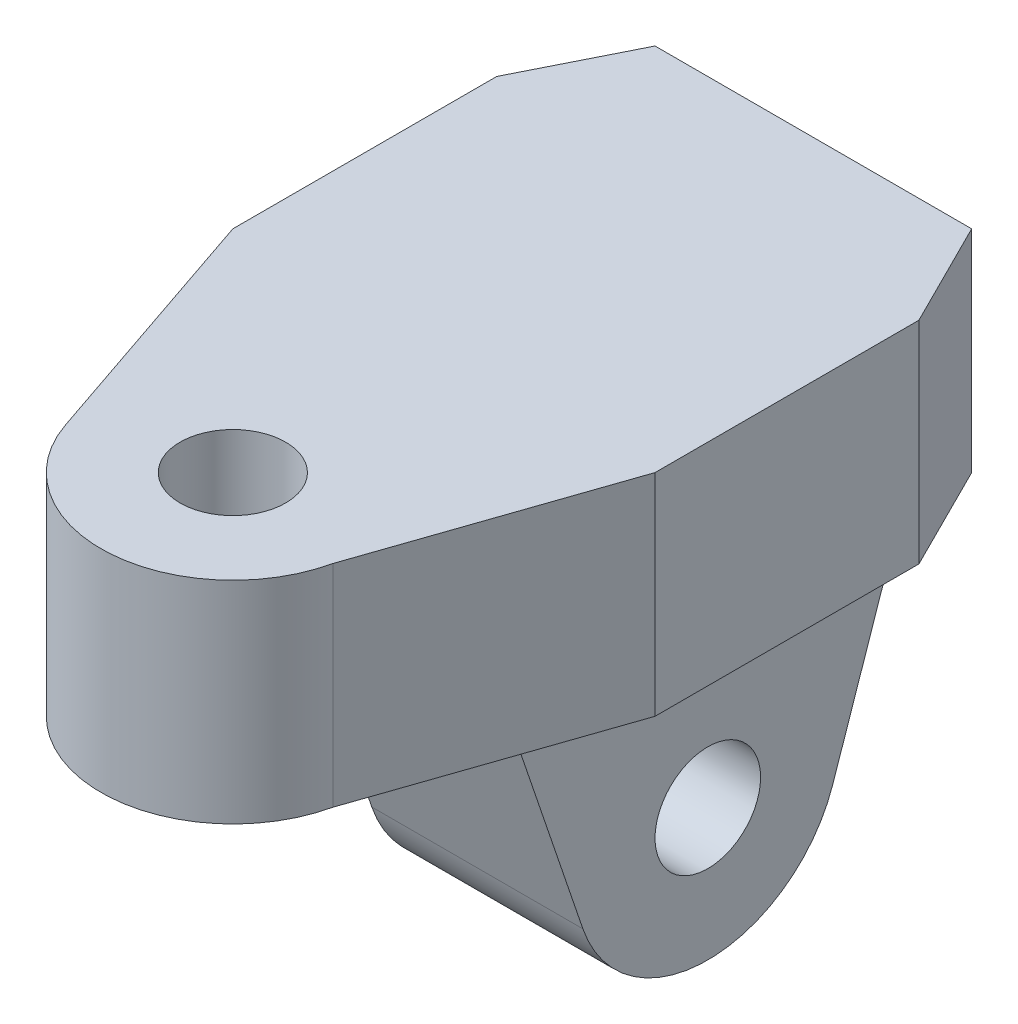
ISO-10303-21;
HEADER;
FILE_DESCRIPTION(('STEP AP214'),'2;1');
FILE_NAME('part.step','',(''),(''),'','','');
FILE_SCHEMA(('AUTOMOTIVE_DESIGN { 1 0 10303 214 1 1 1 1 }'));
ENDSEC;
DATA;
#1=APPLICATION_CONTEXT('core data for automotive mechanical design processes');
#2=APPLICATION_PROTOCOL_DEFINITION('international standard','automotive_design',2000,#1);
#3=PRODUCT_CONTEXT('',#1,'mechanical');
#4=PRODUCT('Part','Part','',(#3));
#5=PRODUCT_RELATED_PRODUCT_CATEGORY('part','',(#4));
#6=PRODUCT_DEFINITION_FORMATION('','',#4);
#7=PRODUCT_DEFINITION_CONTEXT('part definition',#1,'design');
#8=PRODUCT_DEFINITION('design','',#6,#7);
#9=PRODUCT_DEFINITION_SHAPE('','',#8);
#10=(LENGTH_UNIT() NAMED_UNIT(*) SI_UNIT(.MILLI.,.METRE.));
#11=(NAMED_UNIT(*) PLANE_ANGLE_UNIT() SI_UNIT($,.RADIAN.));
#12=(NAMED_UNIT(*) SI_UNIT($,.STERADIAN.) SOLID_ANGLE_UNIT());
#13=UNCERTAINTY_MEASURE_WITH_UNIT(LENGTH_MEASURE(1.E-05),#10,'distance_accuracy_value','');
#14=(GEOMETRIC_REPRESENTATION_CONTEXT(3) GLOBAL_UNCERTAINTY_ASSIGNED_CONTEXT((#13)) GLOBAL_UNIT_ASSIGNED_CONTEXT((#10,
#11,#12)) REPRESENTATION_CONTEXT('',''));
#15=CARTESIAN_POINT('',(0.,0.,0.));
#16=DIRECTION('',(0.,0.,1.));
#17=DIRECTION('',(1.,0.,0.));
#18=AXIS2_PLACEMENT_3D('',#15,#16,#17);
#19=CARTESIAN_POINT('',(0.,0.,-6.));
#20=DIRECTION('',(0.,0.,-1.));
#21=DIRECTION('',(0.,1.,0.));
#22=AXIS2_PLACEMENT_3D('',#19,#20,#21);
#23=PLANE('',#22);
#24=DIRECTION('',(-0.707106781186541,0.707106781186554,0.));
#25=VECTOR('',#24,1.);
#26=CARTESIAN_POINT('',(-9.,12.,-6.));
#27=LINE('',#26,#25);
#28=CARTESIAN_POINT('',(-6.,8.99999999999995,-6.));
#29=VERTEX_POINT('',#28);
#30=CARTESIAN_POINT('',(-9.,12.,-6.));
#31=VERTEX_POINT('',#30);
#32=EDGE_CURVE('E204',#29,#31,#27,.T.);
#33=ORIENTED_EDGE('',*,*,#32,.T.);
#34=DIRECTION('',(1.,0.,0.));
#35=VECTOR('',#34,1.);
#36=CARTESIAN_POINT('',(0.,12.,-6.));
#37=LINE('',#36,#35);
#38=CARTESIAN_POINT('',(-6.,12.,-6.));
#39=VERTEX_POINT('',#38);
#40=EDGE_CURVE('E11',#31,#39,#37,.T.);
#41=ORIENTED_EDGE('',*,*,#40,.T.);
#42=DIRECTION('',(0.,-1.,0.));
#43=VECTOR('',#42,1.);
#44=CARTESIAN_POINT('',(-6.,8.99999999999995,-6.));
#45=LINE('',#44,#43);
#46=EDGE_CURVE('E201',#39,#29,#45,.T.);
#47=ORIENTED_EDGE('',*,*,#46,.T.);
#48=EDGE_LOOP('',(#33,#41,#47));
#49=FACE_BOUND('',#48,.T.);
#50=ADVANCED_FACE('F32',(#49),#23,.T.);
#51=DIRECTION('',(0.,1.,0.));
#52=VECTOR('',#51,1.);
#53=CARTESIAN_POINT('',(6.,9.00000000000007,-6.));
#54=LINE('',#53,#52);
#55=CARTESIAN_POINT('',(6.,9.00000000000008,-6.));
#56=VERTEX_POINT('',#55);
#57=CARTESIAN_POINT('',(6.,12.,-6.));
#58=VERTEX_POINT('',#57);
#59=EDGE_CURVE('E47',#56,#58,#54,.T.);
#60=ORIENTED_EDGE('',*,*,#59,.T.);
#61=CARTESIAN_POINT('',(9.,12.,-6.));
#62=VERTEX_POINT('',#61);
#63=EDGE_CURVE('E36',#58,#62,#37,.T.);
#64=ORIENTED_EDGE('',*,*,#63,.T.);
#65=DIRECTION('',(-0.707106781186556,-0.707106781186539,0.));
#66=VECTOR('',#65,1.);
#67=CARTESIAN_POINT('',(9.,12.,-6.));
#68=LINE('',#67,#66);
#69=EDGE_CURVE('E197',#62,#56,#68,.T.);
#70=ORIENTED_EDGE('',*,*,#69,.T.);
#71=EDGE_LOOP('',(#60,#64,#70));
#72=FACE_BOUND('',#71,.T.);
#73=ADVANCED_FACE('F310',(#72),#23,.T.);
#74=CARTESIAN_POINT('',(6.,0.,0.));
#75=DIRECTION('',(1.,0.,0.));
#76=DIRECTION('',(0.,0.,-1.));
#77=AXIS2_PLACEMENT_3D('',#74,#75,#76);
#78=PLANE('',#77);
#79=ORIENTED_EDGE('',*,*,#59,.F.);
#80=DIRECTION('',(0.,0.,1.));
#81=VECTOR('',#80,1.);
#82=CARTESIAN_POINT('',(6.,9.00000000000007,-6.));
#83=LINE('',#82,#81);
#84=CARTESIAN_POINT('',(6.,8.99999999999995,6.));
#85=VERTEX_POINT('',#84);
#86=EDGE_CURVE('E52',#56,#85,#83,.T.);
#87=ORIENTED_EDGE('',*,*,#86,.T.);
#88=DIRECTION('',(0.,1.,0.));
#89=VECTOR('',#88,1.);
#90=CARTESIAN_POINT('',(6.,9.00000000000007,6.));
#91=LINE('',#90,#89);
#92=CARTESIAN_POINT('',(6.,12.,6.));
#93=VERTEX_POINT('',#92);
#94=EDGE_CURVE('E211',#85,#93,#91,.T.);
#95=ORIENTED_EDGE('',*,*,#94,.T.);
#96=DIRECTION('',(0.,0.,1.));
#97=VECTOR('',#96,1.);
#98=CARTESIAN_POINT('',(6.,12.,12.));
#99=LINE('',#98,#97);
#100=CARTESIAN_POINT('',(6.,12.,12.));
#101=VERTEX_POINT('',#100);
#102=EDGE_CURVE('E284',#93,#101,#99,.T.);
#103=ORIENTED_EDGE('',*,*,#102,.T.);
#104=DIRECTION('',(0.,-0.946805722818264,-0.321805722818264));
#105=VECTOR('',#104,1.);
#106=CARTESIAN_POINT('',(6.,12.,12.));
#107=LINE('',#106,#105);
#108=CARTESIAN_POINT('',(6.,-2.41354292113698,7.10104292113698));
#109=VERTEX_POINT('',#108);
#110=EDGE_CURVE('E276',#101,#109,#107,.T.);
#111=ORIENTED_EDGE('',*,*,#110,.T.);
#112=CARTESIAN_POINT('',(6.,0.,0.));
#113=DIRECTION('',(1.,0.,0.));
#114=DIRECTION('',(0.,0.,-1.));
#115=AXIS2_PLACEMENT_3D('',#112,#113,#114);
#116=CIRCLE('',#115,7.5);
#117=CARTESIAN_POINT('',(6.,-2.41354292113698,-7.10104292113697));
#118=VERTEX_POINT('',#117);
#119=EDGE_CURVE('E279',#109,#118,#116,.T.);
#120=ORIENTED_EDGE('',*,*,#119,.T.);
#121=DIRECTION('',(0.,0.946805722818264,-0.321805722818264));
#122=VECTOR('',#121,1.);
#123=CARTESIAN_POINT('',(6.,12.,-12.));
#124=LINE('',#123,#122);
#125=CARTESIAN_POINT('',(6.,12.,-12.));
#126=VERTEX_POINT('',#125);
#127=EDGE_CURVE('E282',#118,#126,#124,.T.);
#128=ORIENTED_EDGE('',*,*,#127,.T.);
#129=EDGE_CURVE('E285',#126,#58,#99,.T.);
#130=ORIENTED_EDGE('',*,*,#129,.T.);
#131=EDGE_LOOP('',(#79,#87,#95,#103,#111,#120,#128,#130));
#132=FACE_BOUND('',#131,.T.);
#133=CARTESIAN_POINT('',(6.,0.,0.));
#134=DIRECTION('',(1.,0.,0.));
#135=DIRECTION('',(0.,0.,-1.));
#136=AXIS2_PLACEMENT_3D('',#133,#134,#135);
#137=CIRCLE('',#136,3.);
#138=CARTESIAN_POINT('',(6.,0.,-3.));
#139=VERTEX_POINT('',#138);
#140=EDGE_CURVE('E270',#139,#139,#137,.T.);
#141=ORIENTED_EDGE('',*,*,#140,.F.);
#142=EDGE_LOOP('',(#141));
#143=FACE_BOUND('',#142,.T.);
#144=ADVANCED_FACE('F323',(#132,#143),#78,.T.);
#145=CARTESIAN_POINT('',(-6.,0.,0.));
#146=DIRECTION('',(1.,0.,0.));
#147=DIRECTION('',(0.,0.,-1.));
#148=AXIS2_PLACEMENT_3D('',#145,#146,#147);
#149=PLANE('',#148);
#150=DIRECTION('',(0.,0.,1.));
#151=VECTOR('',#150,1.);
#152=CARTESIAN_POINT('',(-6.,8.99999999999995,-6.));
#153=LINE('',#152,#151);
#154=CARTESIAN_POINT('',(-6.,8.99999999999995,6.));
#155=VERTEX_POINT('',#154);
#156=EDGE_CURVE('E219',#29,#155,#153,.T.);
#157=ORIENTED_EDGE('',*,*,#156,.F.);
#158=ORIENTED_EDGE('',*,*,#46,.F.);
#159=DIRECTION('',(0.,0.,1.));
#160=VECTOR('',#159,1.);
#161=CARTESIAN_POINT('',(-6.,12.,12.));
#162=LINE('',#161,#160);
#163=CARTESIAN_POINT('',(-6.,12.,-12.));
#164=VERTEX_POINT('',#163);
#165=EDGE_CURVE('E280',#164,#39,#162,.T.);
#166=ORIENTED_EDGE('',*,*,#165,.F.);
#167=DIRECTION('',(0.,0.946805722818264,-0.321805722818264));
#168=VECTOR('',#167,1.);
#169=CARTESIAN_POINT('',(-6.,12.,-12.));
#170=LINE('',#169,#168);
#171=CARTESIAN_POINT('',(-6.,-2.41354292113698,-7.10104292113697));
#172=VERTEX_POINT('',#171);
#173=EDGE_CURVE('E292',#172,#164,#170,.T.);
#174=ORIENTED_EDGE('',*,*,#173,.F.);
#175=CARTESIAN_POINT('',(-6.,0.,0.));
#176=DIRECTION('',(1.,0.,0.));
#177=DIRECTION('',(0.,0.,-1.));
#178=AXIS2_PLACEMENT_3D('',#175,#176,#177);
#179=CIRCLE('',#178,7.5);
#180=CARTESIAN_POINT('',(-6.,-2.41354292113698,7.10104292113698));
#181=VERTEX_POINT('',#180);
#182=EDGE_CURVE('E290',#181,#172,#179,.T.);
#183=ORIENTED_EDGE('',*,*,#182,.F.);
#184=DIRECTION('',(0.,-0.946805722818264,-0.321805722818264));
#185=VECTOR('',#184,1.);
#186=CARTESIAN_POINT('',(-6.,12.,12.));
#187=LINE('',#186,#185);
#188=CARTESIAN_POINT('',(-6.,12.,12.));
#189=VERTEX_POINT('',#188);
#190=EDGE_CURVE('E273',#189,#181,#187,.T.);
#191=ORIENTED_EDGE('',*,*,#190,.F.);
#192=CARTESIAN_POINT('',(-5.99999999999999,12.,6.));
#193=VERTEX_POINT('',#192);
#194=EDGE_CURVE('E294',#193,#189,#162,.T.);
#195=ORIENTED_EDGE('',*,*,#194,.F.);
#196=DIRECTION('',(0.,-1.,0.));
#197=VECTOR('',#196,1.);
#198=CARTESIAN_POINT('',(-6.,8.99999999999995,6.));
#199=LINE('',#198,#197);
#200=EDGE_CURVE('E213',#193,#155,#199,.T.);
#201=ORIENTED_EDGE('',*,*,#200,.T.);
#202=EDGE_LOOP('',(#157,#158,#166,#174,#183,#191,#195,#201));
#203=FACE_BOUND('',#202,.T.);
#204=CARTESIAN_POINT('',(-6.,0.,0.));
#205=DIRECTION('',(1.,0.,0.));
#206=DIRECTION('',(0.,0.,-1.));
#207=AXIS2_PLACEMENT_3D('',#204,#205,#206);
#208=CIRCLE('',#207,3.);
#209=CARTESIAN_POINT('',(-6.,0.,-3.));
#210=VERTEX_POINT('',#209);
#211=EDGE_CURVE('E269',#210,#210,#208,.T.);
#212=ORIENTED_EDGE('',*,*,#211,.T.);
#213=EDGE_LOOP('',(#212));
#214=FACE_BOUND('',#213,.T.);
#215=ADVANCED_FACE('F332',(#203,#214),#149,.F.);
#216=CARTESIAN_POINT('',(6.,12.,12.));
#217=DIRECTION('',(0.,0.321805722818264,-0.946805722818264));
#218=DIRECTION('',(0.,0.946805722818264,0.321805722818264));
#219=AXIS2_PLACEMENT_3D('',#216,#217,#218);
#220=PLANE('',#219);
#221=ORIENTED_EDGE('',*,*,#190,.T.);
#222=DIRECTION('',(-1.,0.,0.));
#223=VECTOR('',#222,1.);
#224=CARTESIAN_POINT('',(6.,-2.41354292113698,7.10104292113698));
#225=LINE('',#224,#223);
#226=EDGE_CURVE('E303',#109,#181,#225,.T.);
#227=ORIENTED_EDGE('',*,*,#226,.F.);
#228=ORIENTED_EDGE('',*,*,#110,.F.);
#229=DIRECTION('',(-1.,0.,0.));
#230=VECTOR('',#229,1.);
#231=CARTESIAN_POINT('',(6.,12.,12.));
#232=LINE('',#231,#230);
#233=EDGE_CURVE('E287',#101,#189,#232,.T.);
#234=ORIENTED_EDGE('',*,*,#233,.T.);
#235=EDGE_LOOP('',(#221,#227,#228,#234));
#236=FACE_BOUND('',#235,.T.);
#237=ADVANCED_FACE('F34',(#236),#220,.F.);
#238=CARTESIAN_POINT('',(6.,0.,0.));
#239=DIRECTION('',(-1.,0.,0.));
#240=DIRECTION('',(0.,0.,1.));
#241=AXIS2_PLACEMENT_3D('',#238,#239,#240);
#242=CYLINDRICAL_SURFACE('',#241,7.5);
#243=ORIENTED_EDGE('',*,*,#182,.T.);
#244=DIRECTION('',(-1.,0.,0.));
#245=VECTOR('',#244,1.);
#246=CARTESIAN_POINT('',(6.,-2.41354292113698,-7.10104292113697));
#247=LINE('',#246,#245);
#248=EDGE_CURVE('E301',#118,#172,#247,.T.);
#249=ORIENTED_EDGE('',*,*,#248,.F.);
#250=ORIENTED_EDGE('',*,*,#119,.F.);
#251=ORIENTED_EDGE('',*,*,#226,.T.);
#252=EDGE_LOOP('',(#243,#249,#250,#251));
#253=FACE_BOUND('',#252,.T.);
#254=ADVANCED_FACE('F337',(#253),#242,.T.);
#255=CARTESIAN_POINT('',(6.,12.,-12.));
#256=DIRECTION('',(0.,0.321805722818264,0.946805722818264));
#257=DIRECTION('',(0.,-0.946805722818264,0.321805722818264));
#258=AXIS2_PLACEMENT_3D('',#255,#256,#257);
#259=PLANE('',#258);
#260=ORIENTED_EDGE('',*,*,#173,.T.);
#261=DIRECTION('',(-1.,0.,0.));
#262=VECTOR('',#261,1.);
#263=CARTESIAN_POINT('',(6.,12.,-12.));
#264=LINE('',#263,#262);
#265=EDGE_CURVE('E298',#126,#164,#264,.T.);
#266=ORIENTED_EDGE('',*,*,#265,.F.);
#267=ORIENTED_EDGE('',*,*,#127,.F.);
#268=ORIENTED_EDGE('',*,*,#248,.T.);
#269=EDGE_LOOP('',(#260,#266,#267,#268));
#270=FACE_BOUND('',#269,.T.);
#271=ADVANCED_FACE('F340',(#270),#259,.F.);
#272=CARTESIAN_POINT('',(6.,0.,0.));
#273=DIRECTION('',(-1.,0.,0.));
#274=DIRECTION('',(0.,0.,1.));
#275=AXIS2_PLACEMENT_3D('',#272,#273,#274);
#276=CYLINDRICAL_SURFACE('',#275,3.);
#277=ORIENTED_EDGE('',*,*,#140,.T.);
#278=EDGE_LOOP('',(#277));
#279=FACE_BOUND('',#278,.T.);
#280=ORIENTED_EDGE('',*,*,#211,.F.);
#281=EDGE_LOOP('',(#280));
#282=FACE_BOUND('',#281,.T.);
#283=ADVANCED_FACE('F451',(#279,#282),#276,.F.);
#284=CARTESIAN_POINT('',(0.,12.,21.));
#285=DIRECTION('',(0.,1.,0.));
#286=DIRECTION('',(0.,0.,1.));
#287=AXIS2_PLACEMENT_3D('',#284,#285,#286);
#288=PLANE('',#287);
#289=CARTESIAN_POINT('',(0.,12.,21.));
#290=DIRECTION('',(0.,1.,0.));
#291=DIRECTION('',(0.,0.,1.));
#292=AXIS2_PLACEMENT_3D('',#289,#290,#291);
#293=CIRCLE('',#292,3.);
#294=CARTESIAN_POINT('',(0.,12.,24.));
#295=VERTEX_POINT('',#294);
#296=EDGE_CURVE('E237',#295,#295,#293,.T.);
#297=ORIENTED_EDGE('',*,*,#296,.T.);
#298=EDGE_LOOP('',(#297));
#299=FACE_BOUND('',#298,.T.);
#300=DIRECTION('',(0.321805722818264,0.,0.946805722818264));
#301=VECTOR('',#300,1.);
#302=CARTESIAN_POINT('',(-12.,12.,9.));
#303=LINE('',#302,#301);
#304=CARTESIAN_POINT('',(-12.,12.,9.));
#305=VERTEX_POINT('',#304);
#306=CARTESIAN_POINT('',(-7.10104292113698,12.,23.413542921137));
#307=VERTEX_POINT('',#306);
#308=EDGE_CURVE('E241',#305,#307,#303,.T.);
#309=ORIENTED_EDGE('',*,*,#308,.F.);
#310=DIRECTION('',(0.,0.,1.));
#311=VECTOR('',#310,1.);
#312=CARTESIAN_POINT('',(-12.,12.,6.));
#313=LINE('',#312,#311);
#314=CARTESIAN_POINT('',(-12.,12.,-6.));
#315=VERTEX_POINT('',#314);
#316=EDGE_CURVE('E233',#315,#305,#313,.T.);
#317=ORIENTED_EDGE('',*,*,#316,.F.);
#318=DIRECTION('',(-0.447213595499958,0.,0.894427190999916));
#319=VECTOR('',#318,1.);
#320=CARTESIAN_POINT('',(-9.,12.,-12.));
#321=LINE('',#320,#319);
#322=CARTESIAN_POINT('',(-9.,12.,-12.));
#323=VERTEX_POINT('',#322);
#324=EDGE_CURVE('E188',#323,#315,#321,.T.);
#325=ORIENTED_EDGE('',*,*,#324,.F.);
#326=DIRECTION('',(-1.,0.,0.));
#327=VECTOR('',#326,1.);
#328=CARTESIAN_POINT('',(9.,12.,-12.));
#329=LINE('',#328,#327);
#330=EDGE_CURVE('E192',#164,#323,#329,.T.);
#331=ORIENTED_EDGE('',*,*,#330,.F.);
#332=ORIENTED_EDGE('',*,*,#165,.T.);
#333=ORIENTED_EDGE('',*,*,#40,.F.);
#334=DIRECTION('',(0.,0.,1.));
#335=VECTOR('',#334,1.);
#336=CARTESIAN_POINT('',(-9.,12.,-6.));
#337=LINE('',#336,#335);
#338=CARTESIAN_POINT('',(-8.99999999999999,12.,6.));
#339=VERTEX_POINT('',#338);
#340=EDGE_CURVE('E209',#31,#339,#337,.T.);
#341=ORIENTED_EDGE('',*,*,#340,.T.);
#342=DIRECTION('',(-1.,0.,0.));
#343=VECTOR('',#342,1.);
#344=CARTESIAN_POINT('',(12.,12.,6.));
#345=LINE('',#344,#343);
#346=EDGE_CURVE('E226',#193,#339,#345,.T.);
#347=ORIENTED_EDGE('',*,*,#346,.F.);
#348=ORIENTED_EDGE('',*,*,#194,.T.);
#349=ORIENTED_EDGE('',*,*,#233,.F.);
#350=ORIENTED_EDGE('',*,*,#102,.F.);
#351=CARTESIAN_POINT('',(9.,12.,6.));
#352=VERTEX_POINT('',#351);
#353=EDGE_CURVE('E227',#352,#93,#345,.T.);
#354=ORIENTED_EDGE('',*,*,#353,.F.);
#355=DIRECTION('',(0.,0.,1.));
#356=VECTOR('',#355,1.);
#357=CARTESIAN_POINT('',(9.,12.,-6.));
#358=LINE('',#357,#356);
#359=EDGE_CURVE('E223',#62,#352,#358,.T.);
#360=ORIENTED_EDGE('',*,*,#359,.F.);
#361=ORIENTED_EDGE('',*,*,#63,.F.);
#362=ORIENTED_EDGE('',*,*,#129,.F.);
#363=CARTESIAN_POINT('',(9.,12.,-12.));
#364=VERTEX_POINT('',#363);
#365=EDGE_CURVE('E193',#364,#126,#329,.T.);
#366=ORIENTED_EDGE('',*,*,#365,.F.);
#367=DIRECTION('',(-0.447213595499958,0.,-0.894427190999916));
#368=VECTOR('',#367,1.);
#369=CARTESIAN_POINT('',(12.,12.,-6.));
#370=LINE('',#369,#368);
#371=CARTESIAN_POINT('',(12.,12.,-6.));
#372=VERTEX_POINT('',#371);
#373=EDGE_CURVE('E174',#372,#364,#370,.T.);
#374=ORIENTED_EDGE('',*,*,#373,.F.);
#375=DIRECTION('',(0.,0.,1.));
#376=VECTOR('',#375,1.);
#377=CARTESIAN_POINT('',(12.,12.,6.));
#378=LINE('',#377,#376);
#379=CARTESIAN_POINT('',(12.,12.,9.));
#380=VERTEX_POINT('',#379);
#381=EDGE_CURVE('E235',#372,#380,#378,.T.);
#382=ORIENTED_EDGE('',*,*,#381,.T.);
#383=DIRECTION('',(0.324651995250833,0.,-0.945833538197739));
#384=VECTOR('',#383,1.);
#385=CARTESIAN_POINT('',(12.,12.,9.));
#386=LINE('',#385,#384);
#387=CARTESIAN_POINT('',(7.31915304326845,12.,22.6370701662465));
#388=VERTEX_POINT('',#387);
#389=EDGE_CURVE('E247',#388,#380,#386,.T.);
#390=ORIENTED_EDGE('',*,*,#389,.F.);
#391=CARTESIAN_POINT('',(0.,12.,21.));
#392=DIRECTION('',(0.,1.,0.));
#393=DIRECTION('',(0.,0.,1.));
#394=AXIS2_PLACEMENT_3D('',#391,#392,#393);
#395=CIRCLE('',#394,7.5);
#396=EDGE_CURVE('E254',#307,#388,#395,.T.);
#397=ORIENTED_EDGE('',*,*,#396,.F.);
#398=EDGE_LOOP('',(#309,#317,#325,#331,#332,#333,#341,#347,#348,#349,#350,#354,#360,#361,#362,
#366,#374,#382,#390,#397));
#399=FACE_BOUND('',#398,.T.);
#400=ADVANCED_FACE('F315',(#299,#399),#288,.F.);
#401=CARTESIAN_POINT('',(0.,24.,21.));
#402=DIRECTION('',(0.,1.,0.));
#403=DIRECTION('',(0.,0.,1.));
#404=AXIS2_PLACEMENT_3D('',#401,#402,#403);
#405=PLANE('',#404);
#406=DIRECTION('',(0.321805722818264,0.,0.946805722818264));
#407=VECTOR('',#406,1.);
#408=CARTESIAN_POINT('',(-12.,24.,9.00000000000001));
#409=LINE('',#408,#407);
#410=CARTESIAN_POINT('',(-12.,24.,9.00000000000001));
#411=VERTEX_POINT('',#410);
#412=CARTESIAN_POINT('',(-7.10104292113698,24.,23.413542921137));
#413=VERTEX_POINT('',#412);
#414=EDGE_CURVE('E244',#411,#413,#409,.T.);
#415=ORIENTED_EDGE('',*,*,#414,.T.);
#416=CARTESIAN_POINT('',(0.,24.,21.));
#417=DIRECTION('',(0.,1.,0.));
#418=DIRECTION('',(0.,0.,1.));
#419=AXIS2_PLACEMENT_3D('',#416,#417,#418);
#420=CIRCLE('',#419,7.5);
#421=CARTESIAN_POINT('',(7.31915304326845,24.,22.6370701662465));
#422=VERTEX_POINT('',#421);
#423=EDGE_CURVE('E246',#413,#422,#420,.T.);
#424=ORIENTED_EDGE('',*,*,#423,.T.);
#425=DIRECTION('',(0.324651995250833,0.,-0.945833538197739));
#426=VECTOR('',#425,1.);
#427=CARTESIAN_POINT('',(12.,24.,9.00000000000001));
#428=LINE('',#427,#426);
#429=CARTESIAN_POINT('',(12.,24.,9.00000000000001));
#430=VERTEX_POINT('',#429);
#431=EDGE_CURVE('E249',#422,#430,#428,.T.);
#432=ORIENTED_EDGE('',*,*,#431,.T.);
#433=DIRECTION('',(0.,0.,1.));
#434=VECTOR('',#433,1.);
#435=CARTESIAN_POINT('',(12.,24.,6.));
#436=LINE('',#435,#434);
#437=CARTESIAN_POINT('',(12.,24.,-6.));
#438=VERTEX_POINT('',#437);
#439=EDGE_CURVE('E164',#438,#430,#436,.T.);
#440=ORIENTED_EDGE('',*,*,#439,.F.);
#441=DIRECTION('',(-0.447213595499958,0.,-0.894427190999916));
#442=VECTOR('',#441,1.);
#443=CARTESIAN_POINT('',(12.,24.,-6.));
#444=LINE('',#443,#442);
#445=CARTESIAN_POINT('',(9.,24.,-12.));
#446=VERTEX_POINT('',#445);
#447=EDGE_CURVE('E154',#438,#446,#444,.T.);
#448=ORIENTED_EDGE('',*,*,#447,.T.);
#449=DIRECTION('',(-1.,0.,0.));
#450=VECTOR('',#449,1.);
#451=CARTESIAN_POINT('',(9.,24.,-12.));
#452=LINE('',#451,#450);
#453=CARTESIAN_POINT('',(-9.,24.,-12.));
#454=VERTEX_POINT('',#453);
#455=EDGE_CURVE('E161',#446,#454,#452,.T.);
#456=ORIENTED_EDGE('',*,*,#455,.T.);
#457=DIRECTION('',(-0.447213595499958,0.,0.894427190999916));
#458=VECTOR('',#457,1.);
#459=CARTESIAN_POINT('',(-9.,24.,-12.));
#460=LINE('',#459,#458);
#461=CARTESIAN_POINT('',(-12.,24.,-6.));
#462=VERTEX_POINT('',#461);
#463=EDGE_CURVE('E168',#454,#462,#460,.T.);
#464=ORIENTED_EDGE('',*,*,#463,.T.);
#465=DIRECTION('',(0.,0.,1.));
#466=VECTOR('',#465,1.);
#467=CARTESIAN_POINT('',(-12.,24.,6.));
#468=LINE('',#467,#466);
#469=EDGE_CURVE('E231',#462,#411,#468,.T.);
#470=ORIENTED_EDGE('',*,*,#469,.T.);
#471=EDGE_LOOP('',(#415,#424,#432,#440,#448,#456,#464,#470));
#472=FACE_BOUND('',#471,.T.);
#473=CARTESIAN_POINT('',(0.,24.,21.));
#474=DIRECTION('',(0.,1.,0.));
#475=DIRECTION('',(0.,0.,1.));
#476=AXIS2_PLACEMENT_3D('',#473,#474,#475);
#477=CIRCLE('',#476,3.);
#478=CARTESIAN_POINT('',(0.,24.,24.));
#479=VERTEX_POINT('',#478);
#480=EDGE_CURVE('E238',#479,#479,#477,.T.);
#481=ORIENTED_EDGE('',*,*,#480,.F.);
#482=EDGE_LOOP('',(#481));
#483=FACE_BOUND('',#482,.T.);
#484=ADVANCED_FACE('F157',(#472,#483),#405,.T.);
#485=CARTESIAN_POINT('',(-12.,24.,9.00000000000001));
#486=DIRECTION('',(0.946805722818264,0.,-0.321805722818264));
#487=DIRECTION('',(-0.321805722818264,0.,-0.946805722818264));
#488=AXIS2_PLACEMENT_3D('',#485,#486,#487);
#489=PLANE('',#488);
#490=ORIENTED_EDGE('',*,*,#308,.T.);
#491=DIRECTION('',(0.,-1.,0.));
#492=VECTOR('',#491,1.);
#493=CARTESIAN_POINT('',(-7.10104292113698,24.,23.413542921137));
#494=LINE('',#493,#492);
#495=EDGE_CURVE('E266',#413,#307,#494,.T.);
#496=ORIENTED_EDGE('',*,*,#495,.F.);
#497=ORIENTED_EDGE('',*,*,#414,.F.);
#498=DIRECTION('',(0.,-1.,0.));
#499=VECTOR('',#498,1.);
#500=CARTESIAN_POINT('',(-12.,24.,9.00000000000001));
#501=LINE('',#500,#499);
#502=EDGE_CURVE('E251',#411,#305,#501,.T.);
#503=ORIENTED_EDGE('',*,*,#502,.T.);
#504=EDGE_LOOP('',(#490,#496,#497,#503));
#505=FACE_BOUND('',#504,.T.);
#506=ADVANCED_FACE('F357',(#505),#489,.F.);
#507=CARTESIAN_POINT('',(0.,24.,21.));
#508=DIRECTION('',(0.,-1.,0.));
#509=DIRECTION('',(0.,0.,-1.));
#510=AXIS2_PLACEMENT_3D('',#507,#508,#509);
#511=CYLINDRICAL_SURFACE('',#510,7.5);
#512=ORIENTED_EDGE('',*,*,#396,.T.);
#513=DIRECTION('',(0.,-1.,0.));
#514=VECTOR('',#513,1.);
#515=CARTESIAN_POINT('',(7.31915304326845,24.,22.6370701662465));
#516=LINE('',#515,#514);
#517=EDGE_CURVE('E263',#422,#388,#516,.T.);
#518=ORIENTED_EDGE('',*,*,#517,.F.);
#519=ORIENTED_EDGE('',*,*,#423,.F.);
#520=ORIENTED_EDGE('',*,*,#495,.T.);
#521=EDGE_LOOP('',(#512,#518,#519,#520));
#522=FACE_BOUND('',#521,.T.);
#523=ADVANCED_FACE('F352',(#522),#511,.T.);
#524=CARTESIAN_POINT('',(12.,24.,9.00000000000001));
#525=DIRECTION('',(-0.945833538197739,0.,-0.324651995250833));
#526=DIRECTION('',(-0.324651995250833,0.,0.945833538197739));
#527=AXIS2_PLACEMENT_3D('',#524,#525,#526);
#528=PLANE('',#527);
#529=ORIENTED_EDGE('',*,*,#389,.T.);
#530=DIRECTION('',(0.,-1.,0.));
#531=VECTOR('',#530,1.);
#532=CARTESIAN_POINT('',(12.,24.,9.00000000000001));
#533=LINE('',#532,#531);
#534=EDGE_CURVE('E260',#430,#380,#533,.T.);
#535=ORIENTED_EDGE('',*,*,#534,.F.);
#536=ORIENTED_EDGE('',*,*,#431,.F.);
#537=ORIENTED_EDGE('',*,*,#517,.T.);
#538=EDGE_LOOP('',(#529,#535,#536,#537));
#539=FACE_BOUND('',#538,.T.);
#540=ADVANCED_FACE('F349',(#539),#528,.F.);
#541=CARTESIAN_POINT('',(0.,24.,21.));
#542=DIRECTION('',(0.,-1.,0.));
#543=DIRECTION('',(0.,0.,-1.));
#544=AXIS2_PLACEMENT_3D('',#541,#542,#543);
#545=CYLINDRICAL_SURFACE('',#544,3.);
#546=ORIENTED_EDGE('',*,*,#480,.T.);
#547=EDGE_LOOP('',(#546));
#548=FACE_BOUND('',#547,.T.);
#549=ORIENTED_EDGE('',*,*,#296,.F.);
#550=EDGE_LOOP('',(#549));
#551=FACE_BOUND('',#550,.T.);
#552=ADVANCED_FACE('F477',(#548,#551),#545,.F.);
#553=CARTESIAN_POINT('',(12.,24.,6.));
#554=DIRECTION('',(-1.,0.,0.));
#555=DIRECTION('',(0.,0.,1.));
#556=AXIS2_PLACEMENT_3D('',#553,#554,#555);
#557=PLANE('',#556);
#558=ORIENTED_EDGE('',*,*,#534,.T.);
#559=ORIENTED_EDGE('',*,*,#381,.F.);
#560=DIRECTION('',(0.,-1.,0.));
#561=VECTOR('',#560,1.);
#562=CARTESIAN_POINT('',(12.,24.,-6.));
#563=LINE('',#562,#561);
#564=EDGE_CURVE('E195',#438,#372,#563,.T.);
#565=ORIENTED_EDGE('',*,*,#564,.F.);
#566=ORIENTED_EDGE('',*,*,#439,.T.);
#567=EDGE_LOOP('',(#558,#559,#565,#566));
#568=FACE_BOUND('',#567,.T.);
#569=ADVANCED_FACE('F346',(#568),#557,.F.);
#570=CARTESIAN_POINT('',(-12.,12.,6.));
#571=DIRECTION('',(1.,0.,0.));
#572=DIRECTION('',(0.,0.,-1.));
#573=AXIS2_PLACEMENT_3D('',#570,#571,#572);
#574=PLANE('',#573);
#575=ORIENTED_EDGE('',*,*,#502,.F.);
#576=ORIENTED_EDGE('',*,*,#469,.F.);
#577=DIRECTION('',(0.,1.,0.));
#578=VECTOR('',#577,1.);
#579=CARTESIAN_POINT('',(-12.,12.,-6.));
#580=LINE('',#579,#578);
#581=EDGE_CURVE('E206',#315,#462,#580,.T.);
#582=ORIENTED_EDGE('',*,*,#581,.F.);
#583=ORIENTED_EDGE('',*,*,#316,.T.);
#584=EDGE_LOOP('',(#575,#576,#582,#583));
#585=FACE_BOUND('',#584,.T.);
#586=ADVANCED_FACE('F361',(#585),#574,.F.);
#587=CARTESIAN_POINT('',(0.,0.,6.));
#588=DIRECTION('',(0.,0.,-1.));
#589=DIRECTION('',(0.,1.,0.));
#590=AXIS2_PLACEMENT_3D('',#587,#588,#589);
#591=PLANE('',#590);
#592=DIRECTION('',(-0.707106781186556,-0.707106781186539,0.));
#593=VECTOR('',#592,1.);
#594=CARTESIAN_POINT('',(9.,12.,6.));
#595=LINE('',#594,#593);
#596=EDGE_CURVE('E178',#352,#85,#595,.T.);
#597=ORIENTED_EDGE('',*,*,#596,.F.);
#598=ORIENTED_EDGE('',*,*,#353,.T.);
#599=ORIENTED_EDGE('',*,*,#94,.F.);
#600=EDGE_LOOP('',(#597,#598,#599));
#601=FACE_BOUND('',#600,.T.);
#602=ADVANCED_FACE('F322',(#601),#591,.F.);
#603=ORIENTED_EDGE('',*,*,#200,.F.);
#604=ORIENTED_EDGE('',*,*,#346,.T.);
#605=DIRECTION('',(-0.707106781186541,0.707106781186554,0.));
#606=VECTOR('',#605,1.);
#607=CARTESIAN_POINT('',(-9.,12.,6.));
#608=LINE('',#607,#606);
#609=EDGE_CURVE('E198',#155,#339,#608,.T.);
#610=ORIENTED_EDGE('',*,*,#609,.F.);
#611=EDGE_LOOP('',(#603,#604,#610));
#612=FACE_BOUND('',#611,.T.);
#613=ADVANCED_FACE('F374',(#612),#591,.F.);
#614=CARTESIAN_POINT('',(9.,12.,-6.));
#615=DIRECTION('',(-0.707106781186539,0.707106781186556,0.));
#616=DIRECTION('',(-0.707106781186556,-0.707106781186539,0.));
#617=AXIS2_PLACEMENT_3D('',#614,#615,#616);
#618=PLANE('',#617);
#619=ORIENTED_EDGE('',*,*,#596,.T.);
#620=ORIENTED_EDGE('',*,*,#86,.F.);
#621=ORIENTED_EDGE('',*,*,#69,.F.);
#622=ORIENTED_EDGE('',*,*,#359,.T.);
#623=EDGE_LOOP('',(#619,#620,#621,#622));
#624=FACE_BOUND('',#623,.T.);
#625=ADVANCED_FACE('F319',(#624),#618,.F.);
#626=CARTESIAN_POINT('',(-9.,12.,-6.));
#627=DIRECTION('',(0.707106781186554,0.707106781186541,0.));
#628=DIRECTION('',(-0.707106781186541,0.707106781186554,0.));
#629=AXIS2_PLACEMENT_3D('',#626,#627,#628);
#630=PLANE('',#629);
#631=ORIENTED_EDGE('',*,*,#609,.T.);
#632=ORIENTED_EDGE('',*,*,#340,.F.);
#633=ORIENTED_EDGE('',*,*,#32,.F.);
#634=ORIENTED_EDGE('',*,*,#156,.T.);
#635=EDGE_LOOP('',(#631,#632,#633,#634));
#636=FACE_BOUND('',#635,.T.);
#637=ADVANCED_FACE('F370',(#636),#630,.F.);
#638=CARTESIAN_POINT('',(-9.,24.,-12.));
#639=DIRECTION('',(0.894427190999916,0.,0.447213595499958));
#640=DIRECTION('',(0.447213595499958,0.,-0.894427190999916));
#641=AXIS2_PLACEMENT_3D('',#638,#639,#640);
#642=PLANE('',#641);
#643=ORIENTED_EDGE('',*,*,#324,.T.);
#644=ORIENTED_EDGE('',*,*,#581,.T.);
#645=ORIENTED_EDGE('',*,*,#463,.F.);
#646=DIRECTION('',(0.,-1.,0.));
#647=VECTOR('',#646,1.);
#648=CARTESIAN_POINT('',(-9.,24.,-12.));
#649=LINE('',#648,#647);
#650=EDGE_CURVE('E179',#454,#323,#649,.T.);
#651=ORIENTED_EDGE('',*,*,#650,.T.);
#652=EDGE_LOOP('',(#643,#644,#645,#651));
#653=FACE_BOUND('',#652,.T.);
#654=ADVANCED_FACE('F363',(#653),#642,.F.);
#655=CARTESIAN_POINT('',(12.,24.,-6.));
#656=DIRECTION('',(-0.894427190999916,0.,0.447213595499958));
#657=DIRECTION('',(0.447213595499958,0.,0.894427190999916));
#658=AXIS2_PLACEMENT_3D('',#655,#656,#657);
#659=PLANE('',#658);
#660=ORIENTED_EDGE('',*,*,#373,.T.);
#661=DIRECTION('',(0.,-1.,0.));
#662=VECTOR('',#661,1.);
#663=CARTESIAN_POINT('',(9.,24.,-12.));
#664=LINE('',#663,#662);
#665=EDGE_CURVE('E171',#446,#364,#664,.T.);
#666=ORIENTED_EDGE('',*,*,#665,.F.);
#667=ORIENTED_EDGE('',*,*,#447,.F.);
#668=ORIENTED_EDGE('',*,*,#564,.T.);
#669=EDGE_LOOP('',(#660,#666,#667,#668));
#670=FACE_BOUND('',#669,.T.);
#671=ADVANCED_FACE('F172',(#670),#659,.F.);
#672=CARTESIAN_POINT('',(9.,24.,-12.));
#673=DIRECTION('',(0.,0.,1.));
#674=DIRECTION('',(0.,-1.,0.));
#675=AXIS2_PLACEMENT_3D('',#672,#673,#674);
#676=PLANE('',#675);
#677=ORIENTED_EDGE('',*,*,#365,.T.);
#678=ORIENTED_EDGE('',*,*,#265,.T.);
#679=ORIENTED_EDGE('',*,*,#330,.T.);
#680=ORIENTED_EDGE('',*,*,#650,.F.);
#681=ORIENTED_EDGE('',*,*,#455,.F.);
#682=ORIENTED_EDGE('',*,*,#665,.T.);
#683=EDGE_LOOP('',(#677,#678,#679,#680,#681,#682));
#684=FACE_BOUND('',#683,.T.);
#685=ADVANCED_FACE('F181',(#684),#676,.F.);
#686=CLOSED_SHELL('',(#50,#73,#144,#215,#237,#254,#271,#283,#400,#484,#506,#523,#540,#552,#569,
#586,#602,#613,#625,#637,#654,#671,#685));
#687=MANIFOLD_SOLID_BREP('B2',#686);
#688=ADVANCED_BREP_SHAPE_REPRESENTATION('',(#18,#687),#14);
#689=SHAPE_DEFINITION_REPRESENTATION(#9,#688);
ENDSEC;
END-ISO-10303-21;
